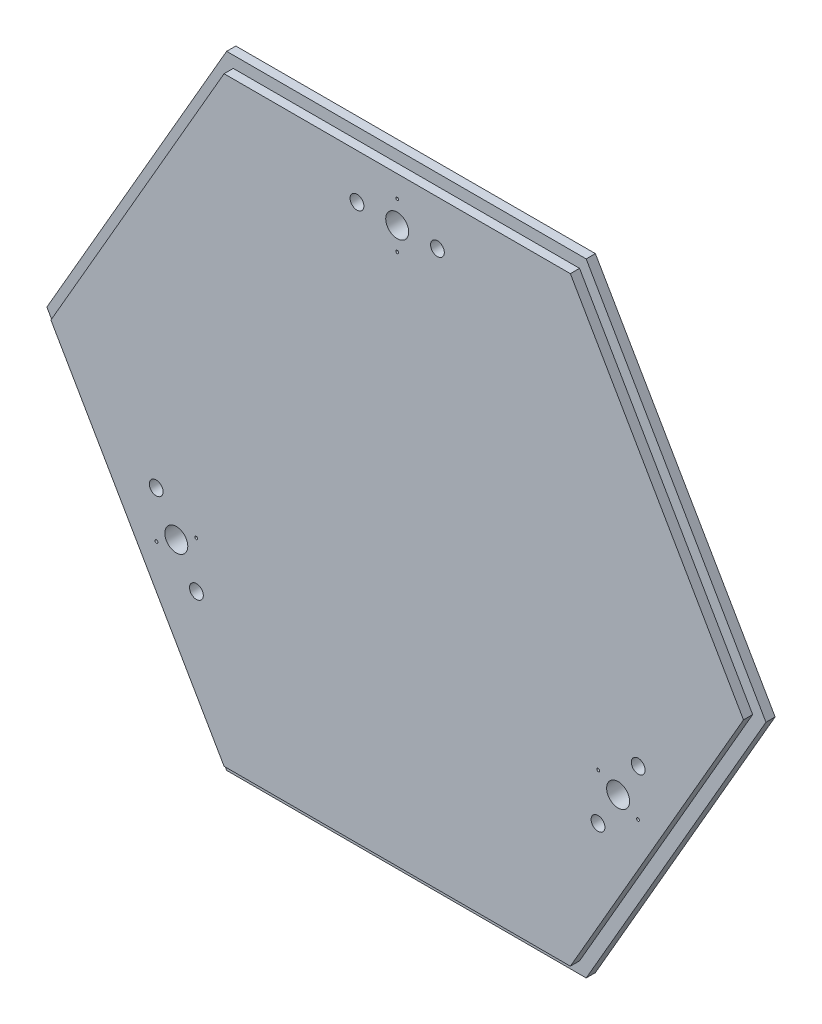
ISO-10303-21;
HEADER;
FILE_DESCRIPTION(('STEP AP214'),'2;1');
FILE_NAME('part.step','',(''),(''),'','','');
FILE_SCHEMA(('AUTOMOTIVE_DESIGN { 1 0 10303 214 1 1 1 1 }'));
ENDSEC;
DATA;
#1=APPLICATION_CONTEXT('core data for automotive mechanical design processes');
#2=APPLICATION_PROTOCOL_DEFINITION('international standard','automotive_design',2000,#1);
#3=PRODUCT_CONTEXT('',#1,'mechanical');
#4=PRODUCT('Part','Part','',(#3));
#5=PRODUCT_RELATED_PRODUCT_CATEGORY('part','',(#4));
#6=PRODUCT_DEFINITION_FORMATION('','',#4);
#7=PRODUCT_DEFINITION_CONTEXT('part definition',#1,'design');
#8=PRODUCT_DEFINITION('design','',#6,#7);
#9=PRODUCT_DEFINITION_SHAPE('','',#8);
#10=(LENGTH_UNIT() NAMED_UNIT(*) SI_UNIT(.MILLI.,.METRE.));
#11=(NAMED_UNIT(*) PLANE_ANGLE_UNIT() SI_UNIT($,.RADIAN.));
#12=(NAMED_UNIT(*) SI_UNIT($,.STERADIAN.) SOLID_ANGLE_UNIT());
#13=UNCERTAINTY_MEASURE_WITH_UNIT(LENGTH_MEASURE(1.E-05),#10,'distance_accuracy_value','');
#14=(GEOMETRIC_REPRESENTATION_CONTEXT(3) GLOBAL_UNCERTAINTY_ASSIGNED_CONTEXT((#13)) GLOBAL_UNIT_ASSIGNED_CONTEXT((#10,
#11,#12)) REPRESENTATION_CONTEXT('',''));
#15=CARTESIAN_POINT('',(0.,0.,0.));
#16=DIRECTION('',(0.,0.,1.));
#17=DIRECTION('',(1.,0.,0.));
#18=AXIS2_PLACEMENT_3D('',#15,#16,#17);
#19=CARTESIAN_POINT('',(0.,0.,0.));
#20=DIRECTION('',(0.,0.,1.));
#21=DIRECTION('',(1.,0.,0.));
#22=AXIS2_PLACEMENT_3D('',#19,#20,#21);
#23=PLANE('',#22);
#24=CARTESIAN_POINT('',(35.,222.,0.));
#25=DIRECTION('',(0.,0.,1.));
#26=DIRECTION('',(1.,0.,0.));
#27=AXIS2_PLACEMENT_3D('',#24,#25,#26);
#28=CIRCLE('',#27,6.);
#29=CARTESIAN_POINT('',(41.,222.,0.));
#30=VERTEX_POINT('',#29);
#31=EDGE_CURVE('E296',#30,#30,#28,.F.);
#32=ORIENTED_EDGE('',*,*,#31,.F.);
#33=EDGE_LOOP('',(#32));
#34=FACE_BOUND('',#33,.T.);
#35=CARTESIAN_POINT('',(-35.,222.,0.));
#36=DIRECTION('',(0.,0.,1.));
#37=DIRECTION('',(1.,0.,0.));
#38=AXIS2_PLACEMENT_3D('',#35,#36,#37);
#39=CIRCLE('',#38,6.00000000000001);
#40=CARTESIAN_POINT('',(-29.,222.,0.));
#41=VERTEX_POINT('',#40);
#42=EDGE_CURVE('E290',#41,#41,#39,.F.);
#43=ORIENTED_EDGE('',*,*,#42,.F.);
#44=EDGE_LOOP('',(#43));
#45=FACE_BOUND('',#44,.T.);
#46=CARTESIAN_POINT('',(-174.757639640145,-141.310889132455,0.));
#47=DIRECTION('',(0.,0.,1.));
#48=DIRECTION('',(1.,0.,0.));
#49=AXIS2_PLACEMENT_3D('',#46,#47,#48);
#50=CIRCLE('',#49,6.00000000000002);
#51=CARTESIAN_POINT('',(-168.757639640145,-141.310889132455,0.));
#52=VERTEX_POINT('',#51);
#53=EDGE_CURVE('E284',#52,#52,#50,.F.);
#54=ORIENTED_EDGE('',*,*,#53,.F.);
#55=EDGE_LOOP('',(#54));
#56=FACE_BOUND('',#55,.T.);
#57=CARTESIAN_POINT('',(-209.757639640145,-80.6891108675447,0.));
#58=DIRECTION('',(0.,0.,1.));
#59=DIRECTION('',(1.,0.,0.));
#60=AXIS2_PLACEMENT_3D('',#57,#58,#59);
#61=CIRCLE('',#60,5.99999999999999);
#62=CARTESIAN_POINT('',(-203.757639640145,-80.6891108675447,0.));
#63=VERTEX_POINT('',#62);
#64=EDGE_CURVE('E278',#63,#63,#61,.F.);
#65=ORIENTED_EDGE('',*,*,#64,.F.);
#66=EDGE_LOOP('',(#65));
#67=FACE_BOUND('',#66,.T.);
#68=CARTESIAN_POINT('',(174.757639640145,-141.310889132455,0.));
#69=DIRECTION('',(0.,0.,1.));
#70=DIRECTION('',(1.,0.,0.));
#71=AXIS2_PLACEMENT_3D('',#68,#69,#70);
#72=CIRCLE('',#71,5.99999999999999);
#73=CARTESIAN_POINT('',(180.757639640145,-141.310889132455,0.));
#74=VERTEX_POINT('',#73);
#75=EDGE_CURVE('E272',#74,#74,#72,.F.);
#76=ORIENTED_EDGE('',*,*,#75,.F.);
#77=EDGE_LOOP('',(#76));
#78=FACE_BOUND('',#77,.T.);
#79=CARTESIAN_POINT('',(209.757639640145,-80.6891108675447,0.));
#80=DIRECTION('',(0.,0.,1.));
#81=DIRECTION('',(1.,0.,0.));
#82=AXIS2_PLACEMENT_3D('',#79,#80,#81);
#83=CIRCLE('',#82,5.99999999999999);
#84=CARTESIAN_POINT('',(215.757639640145,-80.6891108675447,0.));
#85=VERTEX_POINT('',#84);
#86=EDGE_CURVE('E266',#85,#85,#83,.F.);
#87=ORIENTED_EDGE('',*,*,#86,.F.);
#88=EDGE_LOOP('',(#87));
#89=FACE_BOUND('',#88,.T.);
#90=CARTESIAN_POINT('',(0.,222.,0.));
#91=DIRECTION('',(0.,0.,1.));
#92=DIRECTION('',(1.,0.,0.));
#93=AXIS2_PLACEMENT_3D('',#90,#91,#92);
#94=CIRCLE('',#93,10.);
#95=CARTESIAN_POINT('',(10.,222.,0.));
#96=VERTEX_POINT('',#95);
#97=EDGE_CURVE('E209',#96,#96,#94,.T.);
#98=ORIENTED_EDGE('',*,*,#97,.T.);
#99=EDGE_LOOP('',(#98));
#100=FACE_BOUND('',#99,.T.);
#101=CARTESIAN_POINT('',(209.578147715834,-121.,0.));
#102=DIRECTION('',(0.,0.,1.));
#103=DIRECTION('',(1.,0.,0.));
#104=AXIS2_PLACEMENT_3D('',#101,#102,#103);
#105=CIRCLE('',#104,1.25000000000013);
#106=CARTESIAN_POINT('',(210.828147715834,-121.,0.));
#107=VERTEX_POINT('',#106);
#108=EDGE_CURVE('E203',#107,#107,#105,.T.);
#109=ORIENTED_EDGE('',*,*,#108,.T.);
#110=EDGE_LOOP('',(#109));
#111=FACE_BOUND('',#110,.T.);
#112=CARTESIAN_POINT('',(174.937131564456,-101.,0.));
#113=DIRECTION('',(0.,0.,1.));
#114=DIRECTION('',(1.,0.,0.));
#115=AXIS2_PLACEMENT_3D('',#112,#113,#114);
#116=CIRCLE('',#115,1.2500000000001);
#117=CARTESIAN_POINT('',(176.187131564457,-101.,0.));
#118=VERTEX_POINT('',#117);
#119=EDGE_CURVE('E197',#118,#118,#116,.T.);
#120=ORIENTED_EDGE('',*,*,#119,.T.);
#121=EDGE_LOOP('',(#120));
#122=FACE_BOUND('',#121,.T.);
#123=CARTESIAN_POINT('',(-192.257639640145,-111.,0.));
#124=DIRECTION('',(0.,0.,1.));
#125=DIRECTION('',(1.,0.,0.));
#126=AXIS2_PLACEMENT_3D('',#123,#124,#125);
#127=CIRCLE('',#126,10.);
#128=CARTESIAN_POINT('',(-182.257639640145,-111.,0.));
#129=VERTEX_POINT('',#128);
#130=EDGE_CURVE('E191',#129,#129,#127,.T.);
#131=ORIENTED_EDGE('',*,*,#130,.T.);
#132=EDGE_LOOP('',(#131));
#133=FACE_BOUND('',#132,.T.);
#134=CARTESIAN_POINT('',(-209.578147715834,-121.,0.));
#135=DIRECTION('',(0.,0.,1.));
#136=DIRECTION('',(1.,0.,0.));
#137=AXIS2_PLACEMENT_3D('',#134,#135,#136);
#138=CIRCLE('',#137,1.25000000000001);
#139=CARTESIAN_POINT('',(-208.328147715834,-121.,0.));
#140=VERTEX_POINT('',#139);
#141=EDGE_CURVE('E185',#140,#140,#138,.T.);
#142=ORIENTED_EDGE('',*,*,#141,.T.);
#143=EDGE_LOOP('',(#142));
#144=FACE_BOUND('',#143,.T.);
#145=CARTESIAN_POINT('',(-174.937131564456,-101.,0.));
#146=DIRECTION('',(0.,0.,1.));
#147=DIRECTION('',(1.,0.,0.));
#148=AXIS2_PLACEMENT_3D('',#145,#146,#147);
#149=CIRCLE('',#148,1.24999999999997);
#150=CARTESIAN_POINT('',(-173.687131564456,-101.,0.));
#151=VERTEX_POINT('',#150);
#152=EDGE_CURVE('E179',#151,#151,#149,.T.);
#153=ORIENTED_EDGE('',*,*,#152,.T.);
#154=EDGE_LOOP('',(#153));
#155=FACE_BOUND('',#154,.T.);
#156=CARTESIAN_POINT('',(0.,242.,0.));
#157=DIRECTION('',(0.,0.,1.));
#158=DIRECTION('',(1.,0.,0.));
#159=AXIS2_PLACEMENT_3D('',#156,#157,#158);
#160=CIRCLE('',#159,1.24999999999982);
#161=CARTESIAN_POINT('',(1.24999999999981,242.,0.));
#162=VERTEX_POINT('',#161);
#163=EDGE_CURVE('E173',#162,#162,#160,.T.);
#164=ORIENTED_EDGE('',*,*,#163,.T.);
#165=EDGE_LOOP('',(#164));
#166=FACE_BOUND('',#165,.T.);
#167=CARTESIAN_POINT('',(0.,202.,0.));
#168=DIRECTION('',(0.,0.,1.));
#169=DIRECTION('',(1.,0.,0.));
#170=AXIS2_PLACEMENT_3D('',#167,#168,#169);
#171=CIRCLE('',#170,1.25000000000001);
#172=CARTESIAN_POINT('',(1.25000000000001,202.,0.));
#173=VERTEX_POINT('',#172);
#174=EDGE_CURVE('E167',#173,#173,#171,.T.);
#175=ORIENTED_EDGE('',*,*,#174,.T.);
#176=EDGE_LOOP('',(#175));
#177=FACE_BOUND('',#176,.T.);
#178=CARTESIAN_POINT('',(192.257639640145,-111.,0.));
#179=DIRECTION('',(0.,0.,1.));
#180=DIRECTION('',(1.,0.,0.));
#181=AXIS2_PLACEMENT_3D('',#178,#179,#180);
#182=CIRCLE('',#181,10.);
#183=CARTESIAN_POINT('',(202.257639640145,-111.,0.));
#184=VERTEX_POINT('',#183);
#185=EDGE_CURVE('E161',#184,#184,#182,.T.);
#186=ORIENTED_EDGE('',*,*,#185,.T.);
#187=EDGE_LOOP('',(#186));
#188=FACE_BOUND('',#187,.T.);
#189=DIRECTION('',(1.,0.,0.));
#190=VECTOR('',#189,1.);
#191=CARTESIAN_POINT('',(0.,271.,0.));
#192=LINE('',#191,#190);
#193=CARTESIAN_POINT('',(-156.461922950389,271.,0.));
#194=VERTEX_POINT('',#193);
#195=CARTESIAN_POINT('',(156.461922950389,271.,0.));
#196=VERTEX_POINT('',#195);
#197=EDGE_CURVE('E50',#194,#196,#192,.T.);
#198=ORIENTED_EDGE('',*,*,#197,.T.);
#199=DIRECTION('',(0.5,-0.866025403784439,0.));
#200=VECTOR('',#199,1.);
#201=CARTESIAN_POINT('',(234.692884425583,135.5,0.));
#202=LINE('',#201,#200);
#203=CARTESIAN_POINT('',(312.923845900777,0.,0.));
#204=VERTEX_POINT('',#203);
#205=EDGE_CURVE('E149',#196,#204,#202,.T.);
#206=ORIENTED_EDGE('',*,*,#205,.T.);
#207=DIRECTION('',(-0.5,-0.866025403784439,0.));
#208=VECTOR('',#207,1.);
#209=CARTESIAN_POINT('',(234.692884425583,-135.5,0.));
#210=LINE('',#209,#208);
#211=CARTESIAN_POINT('',(156.461922950389,-271.,0.));
#212=VERTEX_POINT('',#211);
#213=EDGE_CURVE('E144',#204,#212,#210,.T.);
#214=ORIENTED_EDGE('',*,*,#213,.T.);
#215=DIRECTION('',(-1.,0.,0.));
#216=VECTOR('',#215,1.);
#217=CARTESIAN_POINT('',(0.,-271.,0.));
#218=LINE('',#217,#216);
#219=CARTESIAN_POINT('',(-156.461922950389,-271.,0.));
#220=VERTEX_POINT('',#219);
#221=EDGE_CURVE('E142',#212,#220,#218,.T.);
#222=ORIENTED_EDGE('',*,*,#221,.T.);
#223=DIRECTION('',(-0.5,0.866025403784439,0.));
#224=VECTOR('',#223,1.);
#225=CARTESIAN_POINT('',(-234.692884425583,-135.5,0.));
#226=LINE('',#225,#224);
#227=CARTESIAN_POINT('',(-312.923845900777,-1.11022302462516E-13,0.));
#228=VERTEX_POINT('',#227);
#229=EDGE_CURVE('E127',#220,#228,#226,.T.);
#230=ORIENTED_EDGE('',*,*,#229,.T.);
#231=DIRECTION('',(0.5,0.866025403784439,0.));
#232=VECTOR('',#231,1.);
#233=CARTESIAN_POINT('',(-234.692884425583,135.5,0.));
#234=LINE('',#233,#232);
#235=EDGE_CURVE('E136',#228,#194,#234,.T.);
#236=ORIENTED_EDGE('',*,*,#235,.T.);
#237=EDGE_LOOP('',(#198,#206,#214,#222,#230,#236));
#238=FACE_BOUND('',#237,.T.);
#239=ADVANCED_FACE('F36',(#34,#45,#56,#67,#78,#89,#100,#111,#122,#133,#144,#155,#166,#177,#188,
#238),#23,.F.);
#240=CARTESIAN_POINT('',(0.,0.,8.));
#241=DIRECTION('',(0.,0.,1.));
#242=DIRECTION('',(1.,0.,0.));
#243=AXIS2_PLACEMENT_3D('',#240,#241,#242);
#244=PLANE('',#243);
#245=DIRECTION('',(1.,0.,0.));
#246=VECTOR('',#245,1.);
#247=CARTESIAN_POINT('',(-150.688420258492,-261.,8.));
#248=LINE('',#247,#246);
#249=CARTESIAN_POINT('',(-150.688420258492,-261.,8.));
#250=VERTEX_POINT('',#249);
#251=CARTESIAN_POINT('',(150.688420258492,-261.,8.));
#252=VERTEX_POINT('',#251);
#253=EDGE_CURVE('E231',#250,#252,#248,.T.);
#254=ORIENTED_EDGE('',*,*,#253,.F.);
#255=DIRECTION('',(0.5,-0.866025403784439,0.));
#256=VECTOR('',#255,1.);
#257=CARTESIAN_POINT('',(-301.376840516985,-1.28906724734583E-13,8.));
#258=LINE('',#257,#256);
#259=CARTESIAN_POINT('',(-301.376840516985,-1.28906724734583E-13,8.));
#260=VERTEX_POINT('',#259);
#261=EDGE_CURVE('E228',#260,#250,#258,.T.);
#262=ORIENTED_EDGE('',*,*,#261,.F.);
#263=DIRECTION('',(-0.5,-0.866025403784439,0.));
#264=VECTOR('',#263,1.);
#265=CARTESIAN_POINT('',(-150.688420258492,261.,8.));
#266=LINE('',#265,#264);
#267=CARTESIAN_POINT('',(-150.688420258492,261.,8.));
#268=VERTEX_POINT('',#267);
#269=EDGE_CURVE('E225',#268,#260,#266,.T.);
#270=ORIENTED_EDGE('',*,*,#269,.F.);
#271=DIRECTION('',(-1.,0.,0.));
#272=VECTOR('',#271,1.);
#273=CARTESIAN_POINT('',(150.688420258492,261.,8.));
#274=LINE('',#273,#272);
#275=CARTESIAN_POINT('',(150.688420258492,261.,8.));
#276=VERTEX_POINT('',#275);
#277=EDGE_CURVE('E222',#276,#268,#274,.T.);
#278=ORIENTED_EDGE('',*,*,#277,.F.);
#279=DIRECTION('',(-0.5,0.866025403784439,0.));
#280=VECTOR('',#279,1.);
#281=CARTESIAN_POINT('',(301.376840516985,0.,8.));
#282=LINE('',#281,#280);
#283=CARTESIAN_POINT('',(301.376840516985,0.,8.));
#284=VERTEX_POINT('',#283);
#285=EDGE_CURVE('E218',#284,#276,#282,.T.);
#286=ORIENTED_EDGE('',*,*,#285,.F.);
#287=DIRECTION('',(0.5,0.866025403784439,0.));
#288=VECTOR('',#287,1.);
#289=CARTESIAN_POINT('',(150.688420258492,-261.,8.));
#290=LINE('',#289,#288);
#291=EDGE_CURVE('E215',#252,#284,#290,.T.);
#292=ORIENTED_EDGE('',*,*,#291,.F.);
#293=EDGE_LOOP('',(#254,#262,#270,#278,#286,#292));
#294=FACE_BOUND('',#293,.T.);
#295=DIRECTION('',(-0.5,0.866025403784439,0.));
#296=VECTOR('',#295,1.);
#297=CARTESIAN_POINT('',(234.692884425583,135.5,8.));
#298=LINE('',#297,#296);
#299=CARTESIAN_POINT('',(312.923845900777,0.,8.));
#300=VERTEX_POINT('',#299);
#301=CARTESIAN_POINT('',(156.461922950389,271.,8.));
#302=VERTEX_POINT('',#301);
#303=EDGE_CURVE('E43',#300,#302,#298,.T.);
#304=ORIENTED_EDGE('',*,*,#303,.T.);
#305=DIRECTION('',(-1.,0.,0.));
#306=VECTOR('',#305,1.);
#307=CARTESIAN_POINT('',(0.,271.,8.));
#308=LINE('',#307,#306);
#309=CARTESIAN_POINT('',(-156.461922950389,271.,8.));
#310=VERTEX_POINT('',#309);
#311=EDGE_CURVE('E12',#302,#310,#308,.T.);
#312=ORIENTED_EDGE('',*,*,#311,.T.);
#313=DIRECTION('',(-0.5,-0.866025403784439,0.));
#314=VECTOR('',#313,1.);
#315=CARTESIAN_POINT('',(-234.692884425583,135.5,8.));
#316=LINE('',#315,#314);
#317=CARTESIAN_POINT('',(-312.923845900777,-1.11022302462516E-13,8.));
#318=VERTEX_POINT('',#317);
#319=EDGE_CURVE('E299',#310,#318,#316,.T.);
#320=ORIENTED_EDGE('',*,*,#319,.T.);
#321=DIRECTION('',(0.5,-0.866025403784439,0.));
#322=VECTOR('',#321,1.);
#323=CARTESIAN_POINT('',(-234.692884425583,-135.5,8.));
#324=LINE('',#323,#322);
#325=CARTESIAN_POINT('',(-156.461922950389,-271.,8.));
#326=VERTEX_POINT('',#325);
#327=EDGE_CURVE('E130',#318,#326,#324,.T.);
#328=ORIENTED_EDGE('',*,*,#327,.T.);
#329=DIRECTION('',(1.,0.,0.));
#330=VECTOR('',#329,1.);
#331=CARTESIAN_POINT('',(0.,-271.,8.));
#332=LINE('',#331,#330);
#333=CARTESIAN_POINT('',(156.461922950389,-271.,8.));
#334=VERTEX_POINT('',#333);
#335=EDGE_CURVE('E302',#326,#334,#332,.T.);
#336=ORIENTED_EDGE('',*,*,#335,.T.);
#337=DIRECTION('',(0.5,0.866025403784439,0.));
#338=VECTOR('',#337,1.);
#339=CARTESIAN_POINT('',(234.692884425583,-135.5,8.));
#340=LINE('',#339,#338);
#341=EDGE_CURVE('E305',#334,#300,#340,.T.);
#342=ORIENTED_EDGE('',*,*,#341,.T.);
#343=EDGE_LOOP('',(#304,#312,#320,#328,#336,#342));
#344=FACE_BOUND('',#343,.T.);
#345=ADVANCED_FACE('F309',(#294,#344),#244,.T.);
#346=CARTESIAN_POINT('',(0.,0.,16.));
#347=DIRECTION('',(0.,0.,1.));
#348=DIRECTION('',(1.,0.,0.));
#349=AXIS2_PLACEMENT_3D('',#346,#347,#348);
#350=PLANE('',#349);
#351=CARTESIAN_POINT('',(192.257639640145,-111.,16.));
#352=DIRECTION('',(0.,0.,1.));
#353=DIRECTION('',(1.,0.,0.));
#354=AXIS2_PLACEMENT_3D('',#351,#352,#353);
#355=CIRCLE('',#354,10.);
#356=CARTESIAN_POINT('',(202.257639640145,-111.,16.));
#357=VERTEX_POINT('',#356);
#358=EDGE_CURVE('E154',#357,#357,#355,.T.);
#359=ORIENTED_EDGE('',*,*,#358,.F.);
#360=EDGE_LOOP('',(#359));
#361=FACE_BOUND('',#360,.T.);
#362=CARTESIAN_POINT('',(0.,202.,16.));
#363=DIRECTION('',(0.,0.,1.));
#364=DIRECTION('',(1.,0.,0.));
#365=AXIS2_PLACEMENT_3D('',#362,#363,#364);
#366=CIRCLE('',#365,1.25000000000001);
#367=CARTESIAN_POINT('',(1.25000000000001,202.,16.));
#368=VERTEX_POINT('',#367);
#369=EDGE_CURVE('E164',#368,#368,#366,.T.);
#370=ORIENTED_EDGE('',*,*,#369,.F.);
#371=EDGE_LOOP('',(#370));
#372=FACE_BOUND('',#371,.T.);
#373=CARTESIAN_POINT('',(0.,242.,16.));
#374=DIRECTION('',(0.,0.,1.));
#375=DIRECTION('',(1.,0.,0.));
#376=AXIS2_PLACEMENT_3D('',#373,#374,#375);
#377=CIRCLE('',#376,1.24999999999982);
#378=CARTESIAN_POINT('',(1.24999999999981,242.,16.));
#379=VERTEX_POINT('',#378);
#380=EDGE_CURVE('E170',#379,#379,#377,.T.);
#381=ORIENTED_EDGE('',*,*,#380,.F.);
#382=EDGE_LOOP('',(#381));
#383=FACE_BOUND('',#382,.T.);
#384=CARTESIAN_POINT('',(-174.937131564456,-101.,16.));
#385=DIRECTION('',(0.,0.,1.));
#386=DIRECTION('',(1.,0.,0.));
#387=AXIS2_PLACEMENT_3D('',#384,#385,#386);
#388=CIRCLE('',#387,1.24999999999997);
#389=CARTESIAN_POINT('',(-173.687131564456,-101.,16.));
#390=VERTEX_POINT('',#389);
#391=EDGE_CURVE('E176',#390,#390,#388,.T.);
#392=ORIENTED_EDGE('',*,*,#391,.F.);
#393=EDGE_LOOP('',(#392));
#394=FACE_BOUND('',#393,.T.);
#395=CARTESIAN_POINT('',(-209.578147715834,-121.,16.));
#396=DIRECTION('',(0.,0.,1.));
#397=DIRECTION('',(1.,0.,0.));
#398=AXIS2_PLACEMENT_3D('',#395,#396,#397);
#399=CIRCLE('',#398,1.25000000000001);
#400=CARTESIAN_POINT('',(-208.328147715834,-121.,16.));
#401=VERTEX_POINT('',#400);
#402=EDGE_CURVE('E182',#401,#401,#399,.T.);
#403=ORIENTED_EDGE('',*,*,#402,.F.);
#404=EDGE_LOOP('',(#403));
#405=FACE_BOUND('',#404,.T.);
#406=CARTESIAN_POINT('',(-192.257639640145,-111.,16.));
#407=DIRECTION('',(0.,0.,1.));
#408=DIRECTION('',(1.,0.,0.));
#409=AXIS2_PLACEMENT_3D('',#406,#407,#408);
#410=CIRCLE('',#409,10.);
#411=CARTESIAN_POINT('',(-182.257639640145,-111.,16.));
#412=VERTEX_POINT('',#411);
#413=EDGE_CURVE('E188',#412,#412,#410,.T.);
#414=ORIENTED_EDGE('',*,*,#413,.F.);
#415=EDGE_LOOP('',(#414));
#416=FACE_BOUND('',#415,.T.);
#417=CARTESIAN_POINT('',(174.937131564456,-101.,16.));
#418=DIRECTION('',(0.,0.,1.));
#419=DIRECTION('',(1.,0.,0.));
#420=AXIS2_PLACEMENT_3D('',#417,#418,#419);
#421=CIRCLE('',#420,1.2500000000001);
#422=CARTESIAN_POINT('',(176.187131564457,-101.,16.));
#423=VERTEX_POINT('',#422);
#424=EDGE_CURVE('E194',#423,#423,#421,.T.);
#425=ORIENTED_EDGE('',*,*,#424,.F.);
#426=EDGE_LOOP('',(#425));
#427=FACE_BOUND('',#426,.T.);
#428=CARTESIAN_POINT('',(209.578147715834,-121.,16.));
#429=DIRECTION('',(0.,0.,1.));
#430=DIRECTION('',(1.,0.,0.));
#431=AXIS2_PLACEMENT_3D('',#428,#429,#430);
#432=CIRCLE('',#431,1.25000000000013);
#433=CARTESIAN_POINT('',(210.828147715834,-121.,16.));
#434=VERTEX_POINT('',#433);
#435=EDGE_CURVE('E200',#434,#434,#432,.T.);
#436=ORIENTED_EDGE('',*,*,#435,.F.);
#437=EDGE_LOOP('',(#436));
#438=FACE_BOUND('',#437,.T.);
#439=CARTESIAN_POINT('',(0.,222.,16.));
#440=DIRECTION('',(0.,0.,1.));
#441=DIRECTION('',(1.,0.,0.));
#442=AXIS2_PLACEMENT_3D('',#439,#440,#441);
#443=CIRCLE('',#442,10.);
#444=CARTESIAN_POINT('',(10.,222.,16.));
#445=VERTEX_POINT('',#444);
#446=EDGE_CURVE('E206',#445,#445,#443,.T.);
#447=ORIENTED_EDGE('',*,*,#446,.F.);
#448=EDGE_LOOP('',(#447));
#449=FACE_BOUND('',#448,.T.);
#450=CARTESIAN_POINT('',(35.,222.,16.));
#451=DIRECTION('',(0.,0.,1.));
#452=DIRECTION('',(1.,0.,0.));
#453=AXIS2_PLACEMENT_3D('',#450,#451,#452);
#454=CIRCLE('',#453,6.);
#455=CARTESIAN_POINT('',(41.,222.,16.));
#456=VERTEX_POINT('',#455);
#457=EDGE_CURVE('E293',#456,#456,#454,.T.);
#458=ORIENTED_EDGE('',*,*,#457,.F.);
#459=EDGE_LOOP('',(#458));
#460=FACE_BOUND('',#459,.T.);
#461=CARTESIAN_POINT('',(-35.,222.,16.));
#462=DIRECTION('',(0.,0.,1.));
#463=DIRECTION('',(1.,0.,0.));
#464=AXIS2_PLACEMENT_3D('',#461,#462,#463);
#465=CIRCLE('',#464,6.00000000000001);
#466=CARTESIAN_POINT('',(-29.,222.,16.));
#467=VERTEX_POINT('',#466);
#468=EDGE_CURVE('E287',#467,#467,#465,.T.);
#469=ORIENTED_EDGE('',*,*,#468,.F.);
#470=EDGE_LOOP('',(#469));
#471=FACE_BOUND('',#470,.T.);
#472=CARTESIAN_POINT('',(-174.757639640145,-141.310889132455,16.));
#473=DIRECTION('',(0.,0.,1.));
#474=DIRECTION('',(1.,0.,0.));
#475=AXIS2_PLACEMENT_3D('',#472,#473,#474);
#476=CIRCLE('',#475,6.00000000000002);
#477=CARTESIAN_POINT('',(-168.757639640145,-141.310889132455,16.));
#478=VERTEX_POINT('',#477);
#479=EDGE_CURVE('E281',#478,#478,#476,.T.);
#480=ORIENTED_EDGE('',*,*,#479,.F.);
#481=EDGE_LOOP('',(#480));
#482=FACE_BOUND('',#481,.T.);
#483=CARTESIAN_POINT('',(-209.757639640145,-80.6891108675447,16.));
#484=DIRECTION('',(0.,0.,1.));
#485=DIRECTION('',(1.,0.,0.));
#486=AXIS2_PLACEMENT_3D('',#483,#484,#485);
#487=CIRCLE('',#486,5.99999999999999);
#488=CARTESIAN_POINT('',(-203.757639640145,-80.6891108675447,16.));
#489=VERTEX_POINT('',#488);
#490=EDGE_CURVE('E275',#489,#489,#487,.T.);
#491=ORIENTED_EDGE('',*,*,#490,.F.);
#492=EDGE_LOOP('',(#491));
#493=FACE_BOUND('',#492,.T.);
#494=CARTESIAN_POINT('',(174.757639640145,-141.310889132455,16.));
#495=DIRECTION('',(0.,0.,1.));
#496=DIRECTION('',(1.,0.,0.));
#497=AXIS2_PLACEMENT_3D('',#494,#495,#496);
#498=CIRCLE('',#497,5.99999999999999);
#499=CARTESIAN_POINT('',(180.757639640145,-141.310889132455,16.));
#500=VERTEX_POINT('',#499);
#501=EDGE_CURVE('E269',#500,#500,#498,.T.);
#502=ORIENTED_EDGE('',*,*,#501,.F.);
#503=EDGE_LOOP('',(#502));
#504=FACE_BOUND('',#503,.T.);
#505=CARTESIAN_POINT('',(209.757639640145,-80.6891108675447,16.));
#506=DIRECTION('',(0.,0.,1.));
#507=DIRECTION('',(1.,0.,0.));
#508=AXIS2_PLACEMENT_3D('',#505,#506,#507);
#509=CIRCLE('',#508,5.99999999999999);
#510=CARTESIAN_POINT('',(215.757639640145,-80.6891108675447,16.));
#511=VERTEX_POINT('',#510);
#512=EDGE_CURVE('E253',#511,#511,#509,.T.);
#513=ORIENTED_EDGE('',*,*,#512,.F.);
#514=EDGE_LOOP('',(#513));
#515=FACE_BOUND('',#514,.T.);
#516=DIRECTION('',(1.,0.,0.));
#517=VECTOR('',#516,1.);
#518=CARTESIAN_POINT('',(-150.688420258492,-261.,16.));
#519=LINE('',#518,#517);
#520=CARTESIAN_POINT('',(-150.688420258492,-261.,16.));
#521=VERTEX_POINT('',#520);
#522=CARTESIAN_POINT('',(150.688420258492,-261.,16.));
#523=VERTEX_POINT('',#522);
#524=EDGE_CURVE('E219',#521,#523,#519,.T.);
#525=ORIENTED_EDGE('',*,*,#524,.T.);
#526=DIRECTION('',(0.5,0.866025403784439,0.));
#527=VECTOR('',#526,1.);
#528=CARTESIAN_POINT('',(150.688420258492,-261.,16.));
#529=LINE('',#528,#527);
#530=CARTESIAN_POINT('',(301.376840516985,0.,16.));
#531=VERTEX_POINT('',#530);
#532=EDGE_CURVE('E212',#523,#531,#529,.T.);
#533=ORIENTED_EDGE('',*,*,#532,.T.);
#534=DIRECTION('',(-0.5,0.866025403784439,0.));
#535=VECTOR('',#534,1.);
#536=CARTESIAN_POINT('',(301.376840516985,0.,16.));
#537=LINE('',#536,#535);
#538=CARTESIAN_POINT('',(150.688420258492,261.,16.));
#539=VERTEX_POINT('',#538);
#540=EDGE_CURVE('E237',#531,#539,#537,.T.);
#541=ORIENTED_EDGE('',*,*,#540,.T.);
#542=DIRECTION('',(-1.,0.,0.));
#543=VECTOR('',#542,1.);
#544=CARTESIAN_POINT('',(150.688420258492,261.,16.));
#545=LINE('',#544,#543);
#546=CARTESIAN_POINT('',(-150.688420258492,261.,16.));
#547=VERTEX_POINT('',#546);
#548=EDGE_CURVE('E240',#539,#547,#545,.T.);
#549=ORIENTED_EDGE('',*,*,#548,.T.);
#550=DIRECTION('',(-0.5,-0.866025403784439,0.));
#551=VECTOR('',#550,1.);
#552=CARTESIAN_POINT('',(-150.688420258492,261.,16.));
#553=LINE('',#552,#551);
#554=CARTESIAN_POINT('',(-301.376840516985,-1.28906724734583E-13,16.));
#555=VERTEX_POINT('',#554);
#556=EDGE_CURVE('E243',#547,#555,#553,.T.);
#557=ORIENTED_EDGE('',*,*,#556,.T.);
#558=DIRECTION('',(0.5,-0.866025403784439,0.));
#559=VECTOR('',#558,1.);
#560=CARTESIAN_POINT('',(-301.376840516985,-1.28906724734583E-13,16.));
#561=LINE('',#560,#559);
#562=EDGE_CURVE('E246',#555,#521,#561,.T.);
#563=ORIENTED_EDGE('',*,*,#562,.T.);
#564=EDGE_LOOP('',(#525,#533,#541,#549,#557,#563));
#565=FACE_BOUND('',#564,.T.);
#566=ADVANCED_FACE('F339',(#361,#372,#383,#394,#405,#416,#427,#438,#449,#460,#471,#482,#493,
#504,#515,#565),#350,.T.);
#567=CARTESIAN_POINT('',(35.,222.,-0.001000000000001));
#568=DIRECTION('',(0.,0.,1.));
#569=DIRECTION('',(1.,0.,0.));
#570=AXIS2_PLACEMENT_3D('',#567,#568,#569);
#571=CYLINDRICAL_SURFACE('',#570,6.);
#572=ORIENTED_EDGE('',*,*,#457,.T.);
#573=EDGE_LOOP('',(#572));
#574=FACE_BOUND('',#573,.T.);
#575=ORIENTED_EDGE('',*,*,#31,.T.);
#576=EDGE_LOOP('',(#575));
#577=FACE_BOUND('',#576,.T.);
#578=ADVANCED_FACE('F376',(#574,#577),#571,.F.);
#579=CARTESIAN_POINT('',(-35.,222.,-0.001000000000001));
#580=DIRECTION('',(0.,0.,1.));
#581=DIRECTION('',(1.,0.,0.));
#582=AXIS2_PLACEMENT_3D('',#579,#580,#581);
#583=CYLINDRICAL_SURFACE('',#582,6.00000000000001);
#584=ORIENTED_EDGE('',*,*,#468,.T.);
#585=EDGE_LOOP('',(#584));
#586=FACE_BOUND('',#585,.T.);
#587=ORIENTED_EDGE('',*,*,#42,.T.);
#588=EDGE_LOOP('',(#587));
#589=FACE_BOUND('',#588,.T.);
#590=ADVANCED_FACE('F460',(#586,#589),#583,.F.);
#591=CARTESIAN_POINT('',(-174.757639640145,-141.310889132455,-0.001000000000001));
#592=DIRECTION('',(0.,0.,1.));
#593=DIRECTION('',(1.,0.,0.));
#594=AXIS2_PLACEMENT_3D('',#591,#592,#593);
#595=CYLINDRICAL_SURFACE('',#594,6.00000000000002);
#596=ORIENTED_EDGE('',*,*,#479,.T.);
#597=EDGE_LOOP('',(#596));
#598=FACE_BOUND('',#597,.T.);
#599=ORIENTED_EDGE('',*,*,#53,.T.);
#600=EDGE_LOOP('',(#599));
#601=FACE_BOUND('',#600,.T.);
#602=ADVANCED_FACE('F456',(#598,#601),#595,.F.);
#603=CARTESIAN_POINT('',(-209.757639640145,-80.6891108675447,-0.001000000000001));
#604=DIRECTION('',(0.,0.,1.));
#605=DIRECTION('',(1.,0.,0.));
#606=AXIS2_PLACEMENT_3D('',#603,#604,#605);
#607=CYLINDRICAL_SURFACE('',#606,5.99999999999999);
#608=ORIENTED_EDGE('',*,*,#490,.T.);
#609=EDGE_LOOP('',(#608));
#610=FACE_BOUND('',#609,.T.);
#611=ORIENTED_EDGE('',*,*,#64,.T.);
#612=EDGE_LOOP('',(#611));
#613=FACE_BOUND('',#612,.T.);
#614=ADVANCED_FACE('F452',(#610,#613),#607,.F.);
#615=CARTESIAN_POINT('',(174.757639640145,-141.310889132455,-0.001000000000001));
#616=DIRECTION('',(0.,0.,1.));
#617=DIRECTION('',(1.,0.,0.));
#618=AXIS2_PLACEMENT_3D('',#615,#616,#617);
#619=CYLINDRICAL_SURFACE('',#618,5.99999999999999);
#620=ORIENTED_EDGE('',*,*,#501,.T.);
#621=EDGE_LOOP('',(#620));
#622=FACE_BOUND('',#621,.T.);
#623=ORIENTED_EDGE('',*,*,#75,.T.);
#624=EDGE_LOOP('',(#623));
#625=FACE_BOUND('',#624,.T.);
#626=ADVANCED_FACE('F448',(#622,#625),#619,.F.);
#627=CARTESIAN_POINT('',(209.757639640145,-80.6891108675447,-0.001000000000001));
#628=DIRECTION('',(0.,0.,1.));
#629=DIRECTION('',(1.,0.,0.));
#630=AXIS2_PLACEMENT_3D('',#627,#628,#629);
#631=CYLINDRICAL_SURFACE('',#630,5.99999999999999);
#632=ORIENTED_EDGE('',*,*,#512,.T.);
#633=EDGE_LOOP('',(#632));
#634=FACE_BOUND('',#633,.T.);
#635=ORIENTED_EDGE('',*,*,#86,.T.);
#636=EDGE_LOOP('',(#635));
#637=FACE_BOUND('',#636,.T.);
#638=ADVANCED_FACE('F444',(#634,#637),#631,.F.);
#639=CARTESIAN_POINT('',(150.688420258492,-261.,8.));
#640=DIRECTION('',(0.866025403784439,-0.5,0.));
#641=DIRECTION('',(0.5,0.866025403784439,0.));
#642=AXIS2_PLACEMENT_3D('',#639,#640,#641);
#643=PLANE('',#642);
#644=ORIENTED_EDGE('',*,*,#532,.F.);
#645=DIRECTION('',(0.,0.,1.));
#646=VECTOR('',#645,1.);
#647=CARTESIAN_POINT('',(150.688420258492,-261.,8.));
#648=LINE('',#647,#646);
#649=EDGE_CURVE('E251',#252,#523,#648,.T.);
#650=ORIENTED_EDGE('',*,*,#649,.F.);
#651=ORIENTED_EDGE('',*,*,#291,.T.);
#652=DIRECTION('',(0.,0.,1.));
#653=VECTOR('',#652,1.);
#654=CARTESIAN_POINT('',(301.376840516985,0.,8.));
#655=LINE('',#654,#653);
#656=EDGE_CURVE('E234',#284,#531,#655,.T.);
#657=ORIENTED_EDGE('',*,*,#656,.T.);
#658=EDGE_LOOP('',(#644,#650,#651,#657));
#659=FACE_BOUND('',#658,.T.);
#660=ADVANCED_FACE('F413',(#659),#643,.T.);
#661=CARTESIAN_POINT('',(-150.688420258492,-261.,8.));
#662=DIRECTION('',(0.,-1.,0.));
#663=DIRECTION('',(0.,0.,-1.));
#664=AXIS2_PLACEMENT_3D('',#661,#662,#663);
#665=PLANE('',#664);
#666=ORIENTED_EDGE('',*,*,#524,.F.);
#667=DIRECTION('',(0.,0.,1.));
#668=VECTOR('',#667,1.);
#669=CARTESIAN_POINT('',(-150.688420258492,-261.,8.));
#670=LINE('',#669,#668);
#671=EDGE_CURVE('E254',#250,#521,#670,.T.);
#672=ORIENTED_EDGE('',*,*,#671,.F.);
#673=ORIENTED_EDGE('',*,*,#253,.T.);
#674=ORIENTED_EDGE('',*,*,#649,.T.);
#675=EDGE_LOOP('',(#666,#672,#673,#674));
#676=FACE_BOUND('',#675,.T.);
#677=ADVANCED_FACE('F409',(#676),#665,.T.);
#678=CARTESIAN_POINT('',(-301.376840516985,-1.28906724734583E-13,8.));
#679=DIRECTION('',(-0.866025403784439,-0.5,0.));
#680=DIRECTION('',(0.5,-0.866025403784439,0.));
#681=AXIS2_PLACEMENT_3D('',#678,#679,#680);
#682=PLANE('',#681);
#683=ORIENTED_EDGE('',*,*,#562,.F.);
#684=DIRECTION('',(0.,0.,1.));
#685=VECTOR('',#684,1.);
#686=CARTESIAN_POINT('',(-301.376840516985,-1.28906724734583E-13,8.));
#687=LINE('',#686,#685);
#688=EDGE_CURVE('E256',#260,#555,#687,.T.);
#689=ORIENTED_EDGE('',*,*,#688,.F.);
#690=ORIENTED_EDGE('',*,*,#261,.T.);
#691=ORIENTED_EDGE('',*,*,#671,.T.);
#692=EDGE_LOOP('',(#683,#689,#690,#691));
#693=FACE_BOUND('',#692,.T.);
#694=ADVANCED_FACE('F427',(#693),#682,.T.);
#695=CARTESIAN_POINT('',(-150.688420258492,261.,8.));
#696=DIRECTION('',(-0.866025403784439,0.5,0.));
#697=DIRECTION('',(-0.5,-0.866025403784439,0.));
#698=AXIS2_PLACEMENT_3D('',#695,#696,#697);
#699=PLANE('',#698);
#700=ORIENTED_EDGE('',*,*,#556,.F.);
#701=DIRECTION('',(0.,0.,1.));
#702=VECTOR('',#701,1.);
#703=CARTESIAN_POINT('',(-150.688420258492,261.,8.));
#704=LINE('',#703,#702);
#705=EDGE_CURVE('E258',#268,#547,#704,.T.);
#706=ORIENTED_EDGE('',*,*,#705,.F.);
#707=ORIENTED_EDGE('',*,*,#269,.T.);
#708=ORIENTED_EDGE('',*,*,#688,.T.);
#709=EDGE_LOOP('',(#700,#706,#707,#708));
#710=FACE_BOUND('',#709,.T.);
#711=ADVANCED_FACE('F424',(#710),#699,.T.);
#712=CARTESIAN_POINT('',(150.688420258492,261.,8.));
#713=DIRECTION('',(0.,1.,0.));
#714=DIRECTION('',(-1.,0.,0.));
#715=AXIS2_PLACEMENT_3D('',#712,#713,#714);
#716=PLANE('',#715);
#717=ORIENTED_EDGE('',*,*,#548,.F.);
#718=DIRECTION('',(0.,0.,1.));
#719=VECTOR('',#718,1.);
#720=CARTESIAN_POINT('',(150.688420258492,261.,8.));
#721=LINE('',#720,#719);
#722=EDGE_CURVE('E260',#276,#539,#721,.T.);
#723=ORIENTED_EDGE('',*,*,#722,.F.);
#724=ORIENTED_EDGE('',*,*,#277,.T.);
#725=ORIENTED_EDGE('',*,*,#705,.T.);
#726=EDGE_LOOP('',(#717,#723,#724,#725));
#727=FACE_BOUND('',#726,.T.);
#728=ADVANCED_FACE('F421',(#727),#716,.T.);
#729=CARTESIAN_POINT('',(301.376840516985,0.,8.));
#730=DIRECTION('',(0.866025403784439,0.5,0.));
#731=DIRECTION('',(-0.5,0.866025403784439,0.));
#732=AXIS2_PLACEMENT_3D('',#729,#730,#731);
#733=PLANE('',#732);
#734=ORIENTED_EDGE('',*,*,#540,.F.);
#735=ORIENTED_EDGE('',*,*,#656,.F.);
#736=ORIENTED_EDGE('',*,*,#285,.T.);
#737=ORIENTED_EDGE('',*,*,#722,.T.);
#738=EDGE_LOOP('',(#734,#735,#736,#737));
#739=FACE_BOUND('',#738,.T.);
#740=ADVANCED_FACE('F417',(#739),#733,.T.);
#741=CARTESIAN_POINT('',(0.,222.,0.));
#742=DIRECTION('',(0.,0.,1.));
#743=DIRECTION('',(1.,0.,0.));
#744=AXIS2_PLACEMENT_3D('',#741,#742,#743);
#745=CYLINDRICAL_SURFACE('',#744,10.);
#746=ORIENTED_EDGE('',*,*,#97,.F.);
#747=EDGE_LOOP('',(#746));
#748=FACE_BOUND('',#747,.T.);
#749=ORIENTED_EDGE('',*,*,#446,.T.);
#750=EDGE_LOOP('',(#749));
#751=FACE_BOUND('',#750,.T.);
#752=ADVANCED_FACE('F442',(#748,#751),#745,.F.);
#753=CARTESIAN_POINT('',(209.578147715834,-121.,0.));
#754=DIRECTION('',(0.,0.,1.));
#755=DIRECTION('',(1.,0.,0.));
#756=AXIS2_PLACEMENT_3D('',#753,#754,#755);
#757=CYLINDRICAL_SURFACE('',#756,1.25000000000013);
#758=ORIENTED_EDGE('',*,*,#108,.F.);
#759=EDGE_LOOP('',(#758));
#760=FACE_BOUND('',#759,.T.);
#761=ORIENTED_EDGE('',*,*,#435,.T.);
#762=EDGE_LOOP('',(#761));
#763=FACE_BOUND('',#762,.T.);
#764=ADVANCED_FACE('F535',(#760,#763),#757,.F.);
#765=CARTESIAN_POINT('',(174.937131564456,-101.,0.));
#766=DIRECTION('',(0.,0.,1.));
#767=DIRECTION('',(1.,0.,0.));
#768=AXIS2_PLACEMENT_3D('',#765,#766,#767);
#769=CYLINDRICAL_SURFACE('',#768,1.2500000000001);
#770=ORIENTED_EDGE('',*,*,#119,.F.);
#771=EDGE_LOOP('',(#770));
#772=FACE_BOUND('',#771,.T.);
#773=ORIENTED_EDGE('',*,*,#424,.T.);
#774=EDGE_LOOP('',(#773));
#775=FACE_BOUND('',#774,.T.);
#776=ADVANCED_FACE('F544',(#772,#775),#769,.F.);
#777=CARTESIAN_POINT('',(-192.257639640145,-111.,0.));
#778=DIRECTION('',(0.,0.,1.));
#779=DIRECTION('',(1.,0.,0.));
#780=AXIS2_PLACEMENT_3D('',#777,#778,#779);
#781=CYLINDRICAL_SURFACE('',#780,10.);
#782=ORIENTED_EDGE('',*,*,#130,.F.);
#783=EDGE_LOOP('',(#782));
#784=FACE_BOUND('',#783,.T.);
#785=ORIENTED_EDGE('',*,*,#413,.T.);
#786=EDGE_LOOP('',(#785));
#787=FACE_BOUND('',#786,.T.);
#788=ADVANCED_FACE('F554',(#784,#787),#781,.F.);
#789=CARTESIAN_POINT('',(-209.578147715834,-121.,0.));
#790=DIRECTION('',(0.,0.,1.));
#791=DIRECTION('',(1.,0.,0.));
#792=AXIS2_PLACEMENT_3D('',#789,#790,#791);
#793=CYLINDRICAL_SURFACE('',#792,1.25000000000001);
#794=ORIENTED_EDGE('',*,*,#141,.F.);
#795=EDGE_LOOP('',(#794));
#796=FACE_BOUND('',#795,.T.);
#797=ORIENTED_EDGE('',*,*,#402,.T.);
#798=EDGE_LOOP('',(#797));
#799=FACE_BOUND('',#798,.T.);
#800=ADVANCED_FACE('F564',(#796,#799),#793,.F.);
#801=CARTESIAN_POINT('',(-174.937131564456,-101.,0.));
#802=DIRECTION('',(0.,0.,1.));
#803=DIRECTION('',(1.,0.,0.));
#804=AXIS2_PLACEMENT_3D('',#801,#802,#803);
#805=CYLINDRICAL_SURFACE('',#804,1.24999999999997);
#806=ORIENTED_EDGE('',*,*,#152,.F.);
#807=EDGE_LOOP('',(#806));
#808=FACE_BOUND('',#807,.T.);
#809=ORIENTED_EDGE('',*,*,#391,.T.);
#810=EDGE_LOOP('',(#809));
#811=FACE_BOUND('',#810,.T.);
#812=ADVANCED_FACE('F574',(#808,#811),#805,.F.);
#813=CARTESIAN_POINT('',(0.,242.,0.));
#814=DIRECTION('',(0.,0.,1.));
#815=DIRECTION('',(1.,0.,0.));
#816=AXIS2_PLACEMENT_3D('',#813,#814,#815);
#817=CYLINDRICAL_SURFACE('',#816,1.24999999999982);
#818=ORIENTED_EDGE('',*,*,#163,.F.);
#819=EDGE_LOOP('',(#818));
#820=FACE_BOUND('',#819,.T.);
#821=ORIENTED_EDGE('',*,*,#380,.T.);
#822=EDGE_LOOP('',(#821));
#823=FACE_BOUND('',#822,.T.);
#824=ADVANCED_FACE('F584',(#820,#823),#817,.F.);
#825=CARTESIAN_POINT('',(0.,202.,0.));
#826=DIRECTION('',(0.,0.,1.));
#827=DIRECTION('',(1.,0.,0.));
#828=AXIS2_PLACEMENT_3D('',#825,#826,#827);
#829=CYLINDRICAL_SURFACE('',#828,1.25000000000001);
#830=ORIENTED_EDGE('',*,*,#174,.F.);
#831=EDGE_LOOP('',(#830));
#832=FACE_BOUND('',#831,.T.);
#833=ORIENTED_EDGE('',*,*,#369,.T.);
#834=EDGE_LOOP('',(#833));
#835=FACE_BOUND('',#834,.T.);
#836=ADVANCED_FACE('F330',(#832,#835),#829,.F.);
#837=CARTESIAN_POINT('',(192.257639640145,-111.,0.));
#838=DIRECTION('',(0.,0.,1.));
#839=DIRECTION('',(1.,0.,0.));
#840=AXIS2_PLACEMENT_3D('',#837,#838,#839);
#841=CYLINDRICAL_SURFACE('',#840,10.);
#842=ORIENTED_EDGE('',*,*,#185,.F.);
#843=EDGE_LOOP('',(#842));
#844=FACE_BOUND('',#843,.T.);
#845=ORIENTED_EDGE('',*,*,#358,.T.);
#846=EDGE_LOOP('',(#845));
#847=FACE_BOUND('',#846,.T.);
#848=ADVANCED_FACE('F323',(#844,#847),#841,.F.);
#849=CARTESIAN_POINT('',(0.,271.,16.));
#850=DIRECTION('',(0.,1.,0.));
#851=DIRECTION('',(-1.,0.,0.));
#852=AXIS2_PLACEMENT_3D('',#849,#850,#851);
#853=PLANE('',#852);
#854=DIRECTION('',(0.,0.,-1.));
#855=VECTOR('',#854,1.);
#856=CARTESIAN_POINT('',(156.461922950389,271.,16.));
#857=LINE('',#856,#855);
#858=EDGE_CURVE('E152',#302,#196,#857,.T.);
#859=ORIENTED_EDGE('',*,*,#858,.T.);
#860=ORIENTED_EDGE('',*,*,#197,.F.);
#861=DIRECTION('',(0.,0.,-1.));
#862=VECTOR('',#861,1.);
#863=CARTESIAN_POINT('',(-156.461922950389,271.,16.));
#864=LINE('',#863,#862);
#865=EDGE_CURVE('E133',#310,#194,#864,.T.);
#866=ORIENTED_EDGE('',*,*,#865,.F.);
#867=ORIENTED_EDGE('',*,*,#311,.F.);
#868=EDGE_LOOP('',(#859,#860,#866,#867));
#869=FACE_BOUND('',#868,.T.);
#870=ADVANCED_FACE('F321',(#869),#853,.T.);
#871=CARTESIAN_POINT('',(234.692884425583,135.5,16.));
#872=DIRECTION('',(0.866025403784439,0.5,0.));
#873=DIRECTION('',(-0.5,0.866025403784439,0.));
#874=AXIS2_PLACEMENT_3D('',#871,#872,#873);
#875=PLANE('',#874);
#876=DIRECTION('',(0.,0.,-1.));
#877=VECTOR('',#876,1.);
#878=CARTESIAN_POINT('',(312.923845900777,0.,16.));
#879=LINE('',#878,#877);
#880=EDGE_CURVE('E155',#300,#204,#879,.T.);
#881=ORIENTED_EDGE('',*,*,#880,.T.);
#882=ORIENTED_EDGE('',*,*,#205,.F.);
#883=ORIENTED_EDGE('',*,*,#858,.F.);
#884=ORIENTED_EDGE('',*,*,#303,.F.);
#885=EDGE_LOOP('',(#881,#882,#883,#884));
#886=FACE_BOUND('',#885,.T.);
#887=ADVANCED_FACE('F313',(#886),#875,.T.);
#888=CARTESIAN_POINT('',(234.692884425583,-135.5,16.));
#889=DIRECTION('',(0.866025403784439,-0.5,0.));
#890=DIRECTION('',(0.5,0.866025403784439,0.));
#891=AXIS2_PLACEMENT_3D('',#888,#889,#890);
#892=PLANE('',#891);
#893=DIRECTION('',(0.,0.,-1.));
#894=VECTOR('',#893,1.);
#895=CARTESIAN_POINT('',(156.461922950389,-271.,16.));
#896=LINE('',#895,#894);
#897=EDGE_CURVE('E157',#334,#212,#896,.T.);
#898=ORIENTED_EDGE('',*,*,#897,.T.);
#899=ORIENTED_EDGE('',*,*,#213,.F.);
#900=ORIENTED_EDGE('',*,*,#880,.F.);
#901=ORIENTED_EDGE('',*,*,#341,.F.);
#902=EDGE_LOOP('',(#898,#899,#900,#901));
#903=FACE_BOUND('',#902,.T.);
#904=ADVANCED_FACE('F317',(#903),#892,.T.);
#905=CARTESIAN_POINT('',(0.,-271.,16.));
#906=DIRECTION('',(0.,-1.,0.));
#907=DIRECTION('',(0.,0.,-1.));
#908=AXIS2_PLACEMENT_3D('',#905,#906,#907);
#909=PLANE('',#908);
#910=DIRECTION('',(0.,0.,-1.));
#911=VECTOR('',#910,1.);
#912=CARTESIAN_POINT('',(-156.461922950389,-271.,16.));
#913=LINE('',#912,#911);
#914=EDGE_CURVE('E132',#326,#220,#913,.T.);
#915=ORIENTED_EDGE('',*,*,#914,.T.);
#916=ORIENTED_EDGE('',*,*,#221,.F.);
#917=ORIENTED_EDGE('',*,*,#897,.F.);
#918=ORIENTED_EDGE('',*,*,#335,.F.);
#919=EDGE_LOOP('',(#915,#916,#917,#918));
#920=FACE_BOUND('',#919,.T.);
#921=ADVANCED_FACE('F320',(#920),#909,.T.);
#922=CARTESIAN_POINT('',(-234.692884425583,-135.5,16.));
#923=DIRECTION('',(-0.866025403784439,-0.5,0.));
#924=DIRECTION('',(0.5,-0.866025403784439,0.));
#925=AXIS2_PLACEMENT_3D('',#922,#923,#924);
#926=PLANE('',#925);
#927=DIRECTION('',(0.,0.,-1.));
#928=VECTOR('',#927,1.);
#929=CARTESIAN_POINT('',(-312.923845900777,-1.11022302462516E-13,16.));
#930=LINE('',#929,#928);
#931=EDGE_CURVE('E58',#318,#228,#930,.T.);
#932=ORIENTED_EDGE('',*,*,#931,.T.);
#933=ORIENTED_EDGE('',*,*,#229,.F.);
#934=ORIENTED_EDGE('',*,*,#914,.F.);
#935=ORIENTED_EDGE('',*,*,#327,.F.);
#936=EDGE_LOOP('',(#932,#933,#934,#935));
#937=FACE_BOUND('',#936,.T.);
#938=ADVANCED_FACE('F124',(#937),#926,.T.);
#939=CARTESIAN_POINT('',(-234.692884425583,135.5,16.));
#940=DIRECTION('',(-0.866025403784439,0.5,0.));
#941=DIRECTION('',(-0.5,-0.866025403784439,0.));
#942=AXIS2_PLACEMENT_3D('',#939,#940,#941);
#943=PLANE('',#942);
#944=ORIENTED_EDGE('',*,*,#865,.T.);
#945=ORIENTED_EDGE('',*,*,#235,.F.);
#946=ORIENTED_EDGE('',*,*,#931,.F.);
#947=ORIENTED_EDGE('',*,*,#319,.F.);
#948=EDGE_LOOP('',(#944,#945,#946,#947));
#949=FACE_BOUND('',#948,.T.);
#950=ADVANCED_FACE('F137',(#949),#943,.T.);
#951=CLOSED_SHELL('',(#239,#345,#566,#578,#590,#602,#614,#626,#638,#660,#677,#694,#711,#728,
#740,#752,#764,#776,#788,#800,#812,#824,#836,#848,#870,#887,#904,#921,#938,#950));
#952=MANIFOLD_SOLID_BREP('B2',#951);
#953=ADVANCED_BREP_SHAPE_REPRESENTATION('',(#18,#952),#14);
#954=SHAPE_DEFINITION_REPRESENTATION(#9,#953);
ENDSEC;
END-ISO-10303-21;
